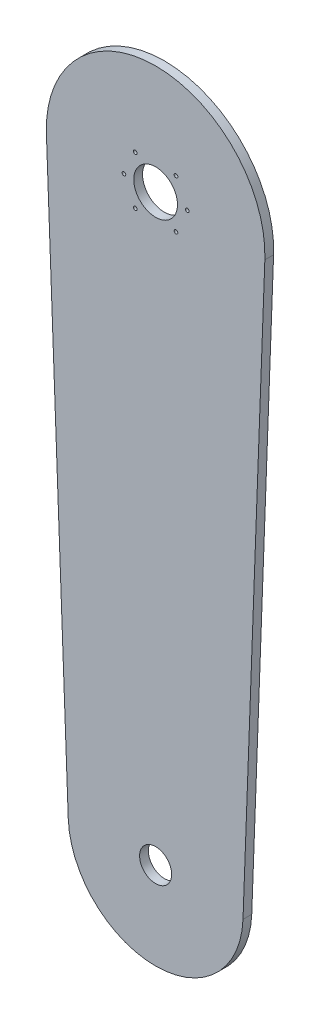
ISO-10303-21;
HEADER;
FILE_DESCRIPTION(('STEP AP214'),'2;1');
FILE_NAME('part.step','',(''),(''),'','','');
FILE_SCHEMA(('AUTOMOTIVE_DESIGN { 1 0 10303 214 1 1 1 1 }'));
ENDSEC;
DATA;
#1=APPLICATION_CONTEXT('core data for automotive mechanical design processes');
#2=APPLICATION_PROTOCOL_DEFINITION('international standard','automotive_design',2000,#1);
#3=PRODUCT_CONTEXT('',#1,'mechanical');
#4=PRODUCT('Part','Part','',(#3));
#5=PRODUCT_RELATED_PRODUCT_CATEGORY('part','',(#4));
#6=PRODUCT_DEFINITION_FORMATION('','',#4);
#7=PRODUCT_DEFINITION_CONTEXT('part definition',#1,'design');
#8=PRODUCT_DEFINITION('design','',#6,#7);
#9=PRODUCT_DEFINITION_SHAPE('','',#8);
#10=(LENGTH_UNIT() NAMED_UNIT(*) SI_UNIT(.MILLI.,.METRE.));
#11=(NAMED_UNIT(*) PLANE_ANGLE_UNIT() SI_UNIT($,.RADIAN.));
#12=(NAMED_UNIT(*) SI_UNIT($,.STERADIAN.) SOLID_ANGLE_UNIT());
#13=UNCERTAINTY_MEASURE_WITH_UNIT(LENGTH_MEASURE(1.E-05),#10,'distance_accuracy_value','');
#14=(GEOMETRIC_REPRESENTATION_CONTEXT(3) GLOBAL_UNCERTAINTY_ASSIGNED_CONTEXT((#13)) GLOBAL_UNIT_ASSIGNED_CONTEXT((#10,
#11,#12)) REPRESENTATION_CONTEXT('',''));
#15=CARTESIAN_POINT('',(0.,0.,0.));
#16=DIRECTION('',(0.,0.,1.));
#17=DIRECTION('',(1.,0.,0.));
#18=AXIS2_PLACEMENT_3D('',#15,#16,#17);
#19=CARTESIAN_POINT('',(0.,0.,6.));
#20=DIRECTION('',(0.,0.,1.));
#21=DIRECTION('',(1.,0.,0.));
#22=AXIS2_PLACEMENT_3D('',#19,#20,#21);
#23=PLANE('',#22);
#24=CARTESIAN_POINT('',(21.75,0.,6.));
#25=DIRECTION('',(0.,0.,1.));
#26=DIRECTION('',(1.,0.,0.));
#27=AXIS2_PLACEMENT_3D('',#24,#25,#26);
#28=CIRCLE('',#27,1.25);
#29=CARTESIAN_POINT('',(23.,0.,6.));
#30=VERTEX_POINT('',#29);
#31=EDGE_CURVE('E172',#30,#30,#28,.T.);
#32=ORIENTED_EDGE('',*,*,#31,.F.);
#33=EDGE_LOOP('',(#32));
#34=FACE_BOUND('',#33,.T.);
#35=CARTESIAN_POINT('',(13.9806305106822,-16.6614666378378,6.));
#36=DIRECTION('',(0.,0.,1.));
#37=DIRECTION('',(1.,0.,0.));
#38=AXIS2_PLACEMENT_3D('',#35,#36,#37);
#39=CIRCLE('',#38,1.25);
#40=CARTESIAN_POINT('',(15.2306305106822,-16.6614666378378,6.));
#41=VERTEX_POINT('',#40);
#42=EDGE_CURVE('E160',#41,#41,#39,.T.);
#43=ORIENTED_EDGE('',*,*,#42,.F.);
#44=EDGE_LOOP('',(#43));
#45=FACE_BOUND('',#44,.T.);
#46=CARTESIAN_POINT('',(-13.9806305106822,16.6614666378378,6.));
#47=DIRECTION('',(0.,0.,1.));
#48=DIRECTION('',(1.,0.,0.));
#49=AXIS2_PLACEMENT_3D('',#46,#47,#48);
#50=CIRCLE('',#49,1.25);
#51=CARTESIAN_POINT('',(-12.7306305106822,16.6614666378378,6.));
#52=VERTEX_POINT('',#51);
#53=EDGE_CURVE('E157',#52,#52,#50,.T.);
#54=ORIENTED_EDGE('',*,*,#53,.F.);
#55=EDGE_LOOP('',(#54));
#56=FACE_BOUND('',#55,.T.);
#57=CARTESIAN_POINT('',(-21.75,0.,6.));
#58=DIRECTION('',(0.,0.,1.));
#59=DIRECTION('',(1.,0.,0.));
#60=AXIS2_PLACEMENT_3D('',#57,#58,#59);
#61=CIRCLE('',#60,1.25);
#62=CARTESIAN_POINT('',(-20.5,0.,6.));
#63=VERTEX_POINT('',#62);
#64=EDGE_CURVE('E154',#63,#63,#61,.T.);
#65=ORIENTED_EDGE('',*,*,#64,.F.);
#66=EDGE_LOOP('',(#65));
#67=FACE_BOUND('',#66,.T.);
#68=CARTESIAN_POINT('',(-13.9806305106822,-16.6614666378378,6.));
#69=DIRECTION('',(0.,0.,1.));
#70=DIRECTION('',(1.,0.,0.));
#71=AXIS2_PLACEMENT_3D('',#68,#69,#70);
#72=CIRCLE('',#71,1.25);
#73=CARTESIAN_POINT('',(-12.7306305106822,-16.6614666378378,6.));
#74=VERTEX_POINT('',#73);
#75=EDGE_CURVE('E150',#74,#74,#72,.T.);
#76=ORIENTED_EDGE('',*,*,#75,.F.);
#77=EDGE_LOOP('',(#76));
#78=FACE_BOUND('',#77,.T.);
#79=CARTESIAN_POINT('',(13.9806305106822,16.6614666378378,6.));
#80=DIRECTION('',(0.,0.,1.));
#81=DIRECTION('',(1.,0.,0.));
#82=AXIS2_PLACEMENT_3D('',#79,#80,#81);
#83=CIRCLE('',#82,1.25);
#84=CARTESIAN_POINT('',(15.2306305106822,16.6614666378378,6.));
#85=VERTEX_POINT('',#84);
#86=EDGE_CURVE('E146',#85,#85,#83,.T.);
#87=ORIENTED_EDGE('',*,*,#86,.F.);
#88=EDGE_LOOP('',(#87));
#89=FACE_BOUND('',#88,.T.);
#90=CARTESIAN_POINT('',(1.02355033522682E-13,-400.,6.));
#91=DIRECTION('',(0.,0.,1.));
#92=DIRECTION('',(1.,0.,0.));
#93=AXIS2_PLACEMENT_3D('',#90,#91,#92);
#94=CIRCLE('',#93,11.);
#95=CARTESIAN_POINT('',(11.0000000000001,-400.,6.));
#96=VERTEX_POINT('',#95);
#97=EDGE_CURVE('E134',#96,#96,#94,.T.);
#98=ORIENTED_EDGE('',*,*,#97,.F.);
#99=EDGE_LOOP('',(#98));
#100=FACE_BOUND('',#99,.T.);
#101=CARTESIAN_POINT('',(0.,0.,6.));
#102=DIRECTION('',(0.,0.,1.));
#103=DIRECTION('',(1.,0.,0.));
#104=AXIS2_PLACEMENT_3D('',#101,#102,#103);
#105=CIRCLE('',#104,75.);
#106=CARTESIAN_POINT('',(74.9472470725243,-2.81249999999998,6.));
#107=VERTEX_POINT('',#106);
#108=CARTESIAN_POINT('',(-74.9472470725242,-2.81250000000002,6.));
#109=VERTEX_POINT('',#108);
#110=EDGE_CURVE('E117',#107,#109,#105,.T.);
#111=ORIENTED_EDGE('',*,*,#110,.T.);
#112=DIRECTION('',(0.0375000000000002,-0.999296627633657,0.));
#113=VECTOR('',#112,1.);
#114=CARTESIAN_POINT('',(-74.9472470725242,-2.81250000000002,6.));
#115=LINE('',#114,#113);
#116=CARTESIAN_POINT('',(-59.9577976580193,-402.25,6.));
#117=VERTEX_POINT('',#116);
#118=EDGE_CURVE('E110',#109,#117,#115,.T.);
#119=ORIENTED_EDGE('',*,*,#118,.T.);
#120=CARTESIAN_POINT('',(1.02355033522682E-13,-400.,6.));
#121=DIRECTION('',(0.,0.,1.));
#122=DIRECTION('',(1.,0.,0.));
#123=AXIS2_PLACEMENT_3D('',#120,#121,#122);
#124=CIRCLE('',#123,60.);
#125=CARTESIAN_POINT('',(59.9577976580196,-402.25,6.));
#126=VERTEX_POINT('',#125);
#127=EDGE_CURVE('E116',#117,#126,#124,.T.);
#128=ORIENTED_EDGE('',*,*,#127,.T.);
#129=DIRECTION('',(-0.0374999999999997,-0.999296627633657,0.));
#130=VECTOR('',#129,1.);
#131=CARTESIAN_POINT('',(74.9472470725243,-2.81249999999998,6.));
#132=LINE('',#131,#130);
#133=EDGE_CURVE('E127',#107,#126,#132,.T.);
#134=ORIENTED_EDGE('',*,*,#133,.F.);
#135=EDGE_LOOP('',(#111,#119,#128,#134));
#136=FACE_BOUND('',#135,.T.);
#137=CARTESIAN_POINT('',(0.,0.,6.));
#138=DIRECTION('',(0.,0.,1.));
#139=DIRECTION('',(1.,0.,0.));
#140=AXIS2_PLACEMENT_3D('',#137,#138,#139);
#141=CIRCLE('',#140,15.);
#142=CARTESIAN_POINT('',(15.,0.,6.));
#143=VERTEX_POINT('',#142);
#144=EDGE_CURVE('E176',#143,#143,#141,.T.);
#145=ORIENTED_EDGE('',*,*,#144,.F.);
#146=EDGE_LOOP('',(#145));
#147=FACE_BOUND('',#146,.T.);
#148=ADVANCED_FACE('F65',(#34,#45,#56,#67,#78,#89,#100,#136,#147),#23,.T.);
#149=CARTESIAN_POINT('',(0.,0.,0.));
#150=DIRECTION('',(0.,0.,1.));
#151=DIRECTION('',(1.,0.,0.));
#152=AXIS2_PLACEMENT_3D('',#149,#150,#151);
#153=PLANE('',#152);
#154=CARTESIAN_POINT('',(21.75,0.,0.));
#155=DIRECTION('',(0.,0.,1.));
#156=DIRECTION('',(1.,0.,0.));
#157=AXIS2_PLACEMENT_3D('',#154,#155,#156);
#158=CIRCLE('',#157,1.25);
#159=CARTESIAN_POINT('',(23.,0.,0.));
#160=VERTEX_POINT('',#159);
#161=EDGE_CURVE('E69',#160,#160,#158,.T.);
#162=ORIENTED_EDGE('',*,*,#161,.T.);
#163=EDGE_LOOP('',(#162));
#164=FACE_BOUND('',#163,.T.);
#165=CARTESIAN_POINT('',(13.9806305106822,-16.6614666378378,0.));
#166=DIRECTION('',(0.,0.,1.));
#167=DIRECTION('',(1.,0.,0.));
#168=AXIS2_PLACEMENT_3D('',#165,#166,#167);
#169=CIRCLE('',#168,1.25);
#170=CARTESIAN_POINT('',(15.2306305106822,-16.6614666378378,0.));
#171=VERTEX_POINT('',#170);
#172=EDGE_CURVE('E158',#171,#171,#169,.T.);
#173=ORIENTED_EDGE('',*,*,#172,.T.);
#174=EDGE_LOOP('',(#173));
#175=FACE_BOUND('',#174,.T.);
#176=CARTESIAN_POINT('',(-13.9806305106822,16.6614666378378,0.));
#177=DIRECTION('',(0.,0.,1.));
#178=DIRECTION('',(1.,0.,0.));
#179=AXIS2_PLACEMENT_3D('',#176,#177,#178);
#180=CIRCLE('',#179,1.25);
#181=CARTESIAN_POINT('',(-12.7306305106822,16.6614666378378,0.));
#182=VERTEX_POINT('',#181);
#183=EDGE_CURVE('E155',#182,#182,#180,.T.);
#184=ORIENTED_EDGE('',*,*,#183,.T.);
#185=EDGE_LOOP('',(#184));
#186=FACE_BOUND('',#185,.T.);
#187=CARTESIAN_POINT('',(-21.75,0.,0.));
#188=DIRECTION('',(0.,0.,1.));
#189=DIRECTION('',(1.,0.,0.));
#190=AXIS2_PLACEMENT_3D('',#187,#188,#189);
#191=CIRCLE('',#190,1.25);
#192=CARTESIAN_POINT('',(-20.5,0.,0.));
#193=VERTEX_POINT('',#192);
#194=EDGE_CURVE('E151',#193,#193,#191,.T.);
#195=ORIENTED_EDGE('',*,*,#194,.T.);
#196=EDGE_LOOP('',(#195));
#197=FACE_BOUND('',#196,.T.);
#198=CARTESIAN_POINT('',(-13.9806305106822,-16.6614666378378,0.));
#199=DIRECTION('',(0.,0.,1.));
#200=DIRECTION('',(1.,0.,0.));
#201=AXIS2_PLACEMENT_3D('',#198,#199,#200);
#202=CIRCLE('',#201,1.25);
#203=CARTESIAN_POINT('',(-12.7306305106822,-16.6614666378378,0.));
#204=VERTEX_POINT('',#203);
#205=EDGE_CURVE('E147',#204,#204,#202,.T.);
#206=ORIENTED_EDGE('',*,*,#205,.T.);
#207=EDGE_LOOP('',(#206));
#208=FACE_BOUND('',#207,.T.);
#209=CARTESIAN_POINT('',(13.9806305106822,16.6614666378378,0.));
#210=DIRECTION('',(0.,0.,1.));
#211=DIRECTION('',(1.,0.,0.));
#212=AXIS2_PLACEMENT_3D('',#209,#210,#211);
#213=CIRCLE('',#212,1.25);
#214=CARTESIAN_POINT('',(15.2306305106822,16.6614666378378,0.));
#215=VERTEX_POINT('',#214);
#216=EDGE_CURVE('E143',#215,#215,#213,.T.);
#217=ORIENTED_EDGE('',*,*,#216,.T.);
#218=EDGE_LOOP('',(#217));
#219=FACE_BOUND('',#218,.T.);
#220=CARTESIAN_POINT('',(0.,0.,0.));
#221=DIRECTION('',(0.,0.,1.));
#222=DIRECTION('',(1.,0.,0.));
#223=AXIS2_PLACEMENT_3D('',#220,#221,#222);
#224=CIRCLE('',#223,75.);
#225=CARTESIAN_POINT('',(74.9472470725243,-2.81249999999998,0.));
#226=VERTEX_POINT('',#225);
#227=CARTESIAN_POINT('',(-74.9472470725242,-2.81250000000002,0.));
#228=VERTEX_POINT('',#227);
#229=EDGE_CURVE('E132',#226,#228,#224,.T.);
#230=ORIENTED_EDGE('',*,*,#229,.F.);
#231=DIRECTION('',(-0.0374999999999997,-0.999296627633657,0.));
#232=VECTOR('',#231,1.);
#233=CARTESIAN_POINT('',(74.9472470725243,-2.81249999999998,0.));
#234=LINE('',#233,#232);
#235=CARTESIAN_POINT('',(59.9577976580196,-402.25,0.));
#236=VERTEX_POINT('',#235);
#237=EDGE_CURVE('E138',#226,#236,#234,.T.);
#238=ORIENTED_EDGE('',*,*,#237,.T.);
#239=CARTESIAN_POINT('',(1.02355033522682E-13,-400.,0.));
#240=DIRECTION('',(0.,0.,1.));
#241=DIRECTION('',(1.,0.,0.));
#242=AXIS2_PLACEMENT_3D('',#239,#240,#241);
#243=CIRCLE('',#242,60.);
#244=CARTESIAN_POINT('',(-59.9577976580193,-402.25,0.));
#245=VERTEX_POINT('',#244);
#246=EDGE_CURVE('E136',#245,#236,#243,.T.);
#247=ORIENTED_EDGE('',*,*,#246,.F.);
#248=DIRECTION('',(0.0375000000000002,-0.999296627633657,0.));
#249=VECTOR('',#248,1.);
#250=CARTESIAN_POINT('',(-74.9472470725242,-2.81250000000002,0.));
#251=LINE('',#250,#249);
#252=EDGE_CURVE('E122',#228,#245,#251,.T.);
#253=ORIENTED_EDGE('',*,*,#252,.F.);
#254=EDGE_LOOP('',(#230,#238,#247,#253));
#255=FACE_BOUND('',#254,.T.);
#256=CARTESIAN_POINT('',(1.02355033522682E-13,-400.,0.));
#257=DIRECTION('',(0.,0.,1.));
#258=DIRECTION('',(1.,0.,0.));
#259=AXIS2_PLACEMENT_3D('',#256,#257,#258);
#260=CIRCLE('',#259,11.);
#261=CARTESIAN_POINT('',(11.0000000000001,-400.,0.));
#262=VERTEX_POINT('',#261);
#263=EDGE_CURVE('E179',#262,#262,#260,.T.);
#264=ORIENTED_EDGE('',*,*,#263,.T.);
#265=EDGE_LOOP('',(#264));
#266=FACE_BOUND('',#265,.T.);
#267=CARTESIAN_POINT('',(0.,0.,0.));
#268=DIRECTION('',(0.,0.,1.));
#269=DIRECTION('',(1.,0.,0.));
#270=AXIS2_PLACEMENT_3D('',#267,#268,#269);
#271=CIRCLE('',#270,15.);
#272=CARTESIAN_POINT('',(15.,0.,0.));
#273=VERTEX_POINT('',#272);
#274=EDGE_CURVE('E175',#273,#273,#271,.T.);
#275=ORIENTED_EDGE('',*,*,#274,.T.);
#276=EDGE_LOOP('',(#275));
#277=FACE_BOUND('',#276,.T.);
#278=ADVANCED_FACE('F187',(#164,#175,#186,#197,#208,#219,#255,#266,#277),#153,.F.);
#279=CARTESIAN_POINT('',(0.,0.,6.));
#280=DIRECTION('',(0.,0.,-1.));
#281=DIRECTION('',(-1.,0.,0.));
#282=AXIS2_PLACEMENT_3D('',#279,#280,#281);
#283=CYLINDRICAL_SURFACE('',#282,75.);
#284=ORIENTED_EDGE('',*,*,#229,.T.);
#285=DIRECTION('',(0.,0.,-1.));
#286=VECTOR('',#285,1.);
#287=CARTESIAN_POINT('',(-74.9472470725242,-2.81250000000002,6.));
#288=LINE('',#287,#286);
#289=EDGE_CURVE('E12',#109,#228,#288,.T.);
#290=ORIENTED_EDGE('',*,*,#289,.F.);
#291=ORIENTED_EDGE('',*,*,#110,.F.);
#292=DIRECTION('',(0.,0.,-1.));
#293=VECTOR('',#292,1.);
#294=CARTESIAN_POINT('',(74.9472470725243,-2.81249999999998,6.));
#295=LINE('',#294,#293);
#296=EDGE_CURVE('E84',#107,#226,#295,.T.);
#297=ORIENTED_EDGE('',*,*,#296,.T.);
#298=EDGE_LOOP('',(#284,#290,#291,#297));
#299=FACE_BOUND('',#298,.T.);
#300=ADVANCED_FACE('F67',(#299),#283,.T.);
#301=CARTESIAN_POINT('',(-74.9472470725242,-2.81250000000002,6.));
#302=DIRECTION('',(0.999296627633657,0.0375000000000002,0.));
#303=DIRECTION('',(-0.0375000000000002,0.999296627633657,0.));
#304=AXIS2_PLACEMENT_3D('',#301,#302,#303);
#305=PLANE('',#304);
#306=ORIENTED_EDGE('',*,*,#252,.T.);
#307=DIRECTION('',(0.,0.,-1.));
#308=VECTOR('',#307,1.);
#309=CARTESIAN_POINT('',(-59.9577976580193,-402.25,6.));
#310=LINE('',#309,#308);
#311=EDGE_CURVE('E75',#117,#245,#310,.T.);
#312=ORIENTED_EDGE('',*,*,#311,.F.);
#313=ORIENTED_EDGE('',*,*,#118,.F.);
#314=ORIENTED_EDGE('',*,*,#289,.T.);
#315=EDGE_LOOP('',(#306,#312,#313,#314));
#316=FACE_BOUND('',#315,.T.);
#317=ADVANCED_FACE('F121',(#316),#305,.F.);
#318=CARTESIAN_POINT('',(1.02355033522682E-13,-400.,6.));
#319=DIRECTION('',(0.,0.,-1.));
#320=DIRECTION('',(-1.,0.,0.));
#321=AXIS2_PLACEMENT_3D('',#318,#319,#320);
#322=CYLINDRICAL_SURFACE('',#321,60.);
#323=ORIENTED_EDGE('',*,*,#246,.T.);
#324=DIRECTION('',(0.,0.,-1.));
#325=VECTOR('',#324,1.);
#326=CARTESIAN_POINT('',(59.9577976580196,-402.25,6.));
#327=LINE('',#326,#325);
#328=EDGE_CURVE('E99',#126,#236,#327,.T.);
#329=ORIENTED_EDGE('',*,*,#328,.F.);
#330=ORIENTED_EDGE('',*,*,#127,.F.);
#331=ORIENTED_EDGE('',*,*,#311,.T.);
#332=EDGE_LOOP('',(#323,#329,#330,#331));
#333=FACE_BOUND('',#332,.T.);
#334=ADVANCED_FACE('F126',(#333),#322,.T.);
#335=CARTESIAN_POINT('',(74.9472470725243,-2.81249999999998,6.));
#336=DIRECTION('',(0.999296627633657,-0.0374999999999997,0.));
#337=DIRECTION('',(0.0374999999999997,0.999296627633657,0.));
#338=AXIS2_PLACEMENT_3D('',#335,#336,#337);
#339=PLANE('',#338);
#340=ORIENTED_EDGE('',*,*,#237,.F.);
#341=ORIENTED_EDGE('',*,*,#296,.F.);
#342=ORIENTED_EDGE('',*,*,#133,.T.);
#343=ORIENTED_EDGE('',*,*,#328,.T.);
#344=EDGE_LOOP('',(#340,#341,#342,#343));
#345=FACE_BOUND('',#344,.T.);
#346=ADVANCED_FACE('F193',(#345),#339,.T.);
#347=CARTESIAN_POINT('',(1.02355033522682E-13,-400.,6.));
#348=DIRECTION('',(0.,0.,-1.));
#349=DIRECTION('',(-1.,0.,0.));
#350=AXIS2_PLACEMENT_3D('',#347,#348,#349);
#351=CYLINDRICAL_SURFACE('',#350,11.);
#352=ORIENTED_EDGE('',*,*,#97,.T.);
#353=EDGE_LOOP('',(#352));
#354=FACE_BOUND('',#353,.T.);
#355=ORIENTED_EDGE('',*,*,#263,.F.);
#356=EDGE_LOOP('',(#355));
#357=FACE_BOUND('',#356,.T.);
#358=ADVANCED_FACE('F190',(#354,#357),#351,.F.);
#359=CARTESIAN_POINT('',(0.,0.,6.));
#360=DIRECTION('',(0.,0.,-1.));
#361=DIRECTION('',(-1.,0.,0.));
#362=AXIS2_PLACEMENT_3D('',#359,#360,#361);
#363=CYLINDRICAL_SURFACE('',#362,15.);
#364=ORIENTED_EDGE('',*,*,#144,.T.);
#365=EDGE_LOOP('',(#364));
#366=FACE_BOUND('',#365,.T.);
#367=ORIENTED_EDGE('',*,*,#274,.F.);
#368=EDGE_LOOP('',(#367));
#369=FACE_BOUND('',#368,.T.);
#370=ADVANCED_FACE('F192',(#366,#369),#363,.F.);
#371=CARTESIAN_POINT('',(13.9806305106822,16.6614666378378,-4.));
#372=DIRECTION('',(0.,0.,1.));
#373=DIRECTION('',(1.,0.,0.));
#374=AXIS2_PLACEMENT_3D('',#371,#372,#373);
#375=CYLINDRICAL_SURFACE('',#374,1.25);
#376=ORIENTED_EDGE('',*,*,#86,.T.);
#377=EDGE_LOOP('',(#376));
#378=FACE_BOUND('',#377,.T.);
#379=ORIENTED_EDGE('',*,*,#216,.F.);
#380=EDGE_LOOP('',(#379));
#381=FACE_BOUND('',#380,.T.);
#382=ADVANCED_FACE('F200',(#378,#381),#375,.F.);
#383=CARTESIAN_POINT('',(-13.9806305106822,-16.6614666378378,-4.));
#384=DIRECTION('',(0.,0.,1.));
#385=DIRECTION('',(1.,0.,0.));
#386=AXIS2_PLACEMENT_3D('',#383,#384,#385);
#387=CYLINDRICAL_SURFACE('',#386,1.25);
#388=ORIENTED_EDGE('',*,*,#75,.T.);
#389=EDGE_LOOP('',(#388));
#390=FACE_BOUND('',#389,.T.);
#391=ORIENTED_EDGE('',*,*,#205,.F.);
#392=EDGE_LOOP('',(#391));
#393=FACE_BOUND('',#392,.T.);
#394=ADVANCED_FACE('F259',(#390,#393),#387,.F.);
#395=CARTESIAN_POINT('',(-21.75,0.,-4.));
#396=DIRECTION('',(0.,0.,1.));
#397=DIRECTION('',(1.,0.,0.));
#398=AXIS2_PLACEMENT_3D('',#395,#396,#397);
#399=CYLINDRICAL_SURFACE('',#398,1.25);
#400=ORIENTED_EDGE('',*,*,#64,.T.);
#401=EDGE_LOOP('',(#400));
#402=FACE_BOUND('',#401,.T.);
#403=ORIENTED_EDGE('',*,*,#194,.F.);
#404=EDGE_LOOP('',(#403));
#405=FACE_BOUND('',#404,.T.);
#406=ADVANCED_FACE('F270',(#402,#405),#399,.F.);
#407=CARTESIAN_POINT('',(-13.9806305106822,16.6614666378378,-4.));
#408=DIRECTION('',(0.,0.,1.));
#409=DIRECTION('',(1.,0.,0.));
#410=AXIS2_PLACEMENT_3D('',#407,#408,#409);
#411=CYLINDRICAL_SURFACE('',#410,1.25);
#412=ORIENTED_EDGE('',*,*,#53,.T.);
#413=EDGE_LOOP('',(#412));
#414=FACE_BOUND('',#413,.T.);
#415=ORIENTED_EDGE('',*,*,#183,.F.);
#416=EDGE_LOOP('',(#415));
#417=FACE_BOUND('',#416,.T.);
#418=ADVANCED_FACE('F280',(#414,#417),#411,.F.);
#419=CARTESIAN_POINT('',(13.9806305106822,-16.6614666378378,-4.));
#420=DIRECTION('',(0.,0.,1.));
#421=DIRECTION('',(1.,0.,0.));
#422=AXIS2_PLACEMENT_3D('',#419,#420,#421);
#423=CYLINDRICAL_SURFACE('',#422,1.25);
#424=ORIENTED_EDGE('',*,*,#42,.T.);
#425=EDGE_LOOP('',(#424));
#426=FACE_BOUND('',#425,.T.);
#427=ORIENTED_EDGE('',*,*,#172,.F.);
#428=EDGE_LOOP('',(#427));
#429=FACE_BOUND('',#428,.T.);
#430=ADVANCED_FACE('F290',(#426,#429),#423,.F.);
#431=CARTESIAN_POINT('',(21.75,0.,-4.));
#432=DIRECTION('',(0.,0.,1.));
#433=DIRECTION('',(1.,0.,0.));
#434=AXIS2_PLACEMENT_3D('',#431,#432,#433);
#435=CYLINDRICAL_SURFACE('',#434,1.25);
#436=ORIENTED_EDGE('',*,*,#31,.T.);
#437=EDGE_LOOP('',(#436));
#438=FACE_BOUND('',#437,.T.);
#439=ORIENTED_EDGE('',*,*,#161,.F.);
#440=EDGE_LOOP('',(#439));
#441=FACE_BOUND('',#440,.T.);
#442=ADVANCED_FACE('F299',(#438,#441),#435,.F.);
#443=CLOSED_SHELL('',(#148,#278,#300,#317,#334,#346,#358,#370,#382,#394,#406,#418,#430,#442));
#444=MANIFOLD_SOLID_BREP('B2',#443);
#445=ADVANCED_BREP_SHAPE_REPRESENTATION('',(#18,#444),#14);
#446=SHAPE_DEFINITION_REPRESENTATION(#9,#445);
ENDSEC;
END-ISO-10303-21;
